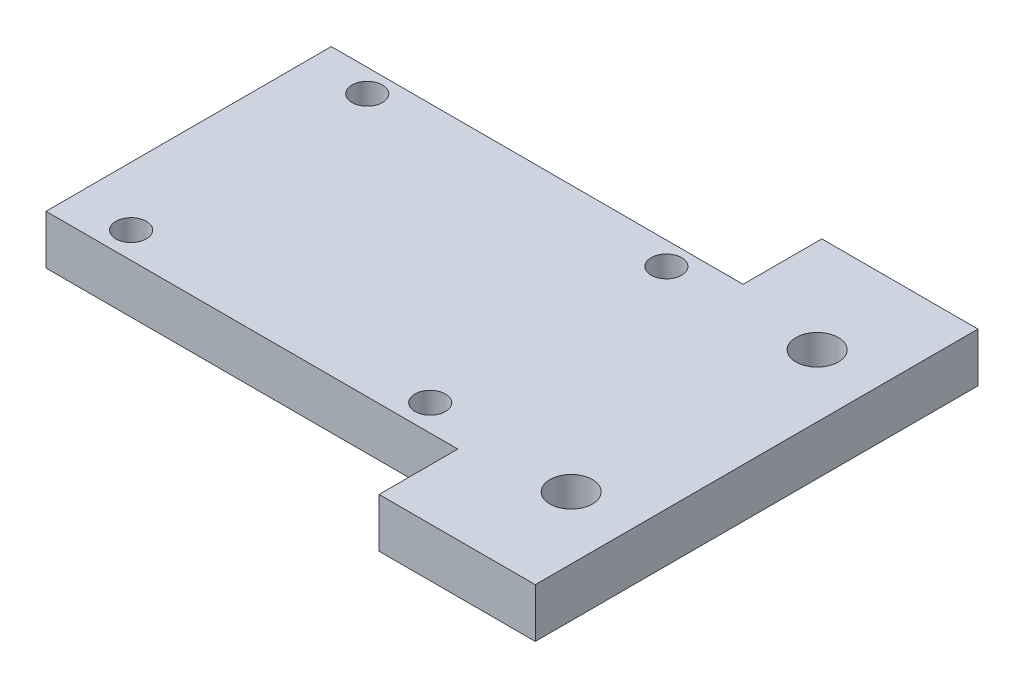
ISO-10303-21;
HEADER;
FILE_DESCRIPTION(('STEP AP214'),'2;1');
FILE_NAME('part.step','',(''),(''),'','','');
FILE_SCHEMA(('AUTOMOTIVE_DESIGN { 1 0 10303 214 1 1 1 1 }'));
ENDSEC;
DATA;
#1=APPLICATION_CONTEXT('core data for automotive mechanical design processes');
#2=APPLICATION_PROTOCOL_DEFINITION('international standard','automotive_design',2000,#1);
#3=PRODUCT_CONTEXT('',#1,'mechanical');
#4=PRODUCT('Part','Part','',(#3));
#5=PRODUCT_RELATED_PRODUCT_CATEGORY('part','',(#4));
#6=PRODUCT_DEFINITION_FORMATION('','',#4);
#7=PRODUCT_DEFINITION_CONTEXT('part definition',#1,'design');
#8=PRODUCT_DEFINITION('design','',#6,#7);
#9=PRODUCT_DEFINITION_SHAPE('','',#8);
#10=(LENGTH_UNIT() NAMED_UNIT(*) SI_UNIT(.MILLI.,.METRE.));
#11=(NAMED_UNIT(*) PLANE_ANGLE_UNIT() SI_UNIT($,.RADIAN.));
#12=(NAMED_UNIT(*) SI_UNIT($,.STERADIAN.) SOLID_ANGLE_UNIT());
#13=UNCERTAINTY_MEASURE_WITH_UNIT(LENGTH_MEASURE(1.E-05),#10,'distance_accuracy_value','');
#14=(GEOMETRIC_REPRESENTATION_CONTEXT(3) GLOBAL_UNCERTAINTY_ASSIGNED_CONTEXT((#13)) GLOBAL_UNIT_ASSIGNED_CONTEXT((#10,
#11,#12)) REPRESENTATION_CONTEXT('',''));
#15=CARTESIAN_POINT('',(0.,0.,0.));
#16=DIRECTION('',(0.,0.,1.));
#17=DIRECTION('',(1.,0.,0.));
#18=AXIS2_PLACEMENT_3D('',#15,#16,#17);
#19=CARTESIAN_POINT('',(0.,5.,0.));
#20=DIRECTION('',(0.,-1.,0.));
#21=DIRECTION('',(0.,0.,-1.));
#22=AXIS2_PLACEMENT_3D('',#19,#20,#21);
#23=PLANE('',#22);
#24=DIRECTION('',(0.,0.,-1.));
#25=VECTOR('',#24,1.);
#26=CARTESIAN_POINT('',(36.55,5.,-27.14922));
#27=LINE('',#26,#25);
#28=CARTESIAN_POINT('',(36.55,5.,39.1739551283588));
#29=VERTEX_POINT('',#28);
#30=CARTESIAN_POINT('',(36.55,5.,-5.82604487164121));
#31=VERTEX_POINT('',#30);
#32=EDGE_CURVE('E111',#29,#31,#27,.T.);
#33=ORIENTED_EDGE('',*,*,#32,.T.);
#34=DIRECTION('',(1.,0.,0.));
#35=VECTOR('',#34,1.);
#36=CARTESIAN_POINT('',(12.6932817043532,5.,-5.8260448716412));
#37=LINE('',#36,#35);
#38=CARTESIAN_POINT('',(20.675,5.,-5.8260448716412));
#39=VERTEX_POINT('',#38);
#40=EDGE_CURVE('E48',#39,#31,#37,.T.);
#41=ORIENTED_EDGE('',*,*,#40,.F.);
#42=DIRECTION('',(0.,0.,1.));
#43=VECTOR('',#42,1.);
#44=CARTESIAN_POINT('',(20.675,5.,2.1739551283588));
#45=LINE('',#44,#43);
#46=CARTESIAN_POINT('',(20.675,5.,2.1739551283588));
#47=VERTEX_POINT('',#46);
#48=EDGE_CURVE('E107',#39,#47,#45,.T.);
#49=ORIENTED_EDGE('',*,*,#48,.T.);
#50=DIRECTION('',(-1.,0.,0.));
#51=VECTOR('',#50,1.);
#52=CARTESIAN_POINT('',(-21.18269604,5.,2.1739551283588));
#53=LINE('',#52,#51);
#54=CARTESIAN_POINT('',(-21.18269604,5.,2.1739551283588));
#55=VERTEX_POINT('',#54);
#56=EDGE_CURVE('E116',#47,#55,#53,.T.);
#57=ORIENTED_EDGE('',*,*,#56,.T.);
#58=DIRECTION('',(0.,0.,1.));
#59=VECTOR('',#58,1.);
#60=CARTESIAN_POINT('',(-21.18269604,5.,31.1739551283588));
#61=LINE('',#60,#59);
#62=CARTESIAN_POINT('',(-21.18269604,5.,31.1739551283588));
#63=VERTEX_POINT('',#62);
#64=EDGE_CURVE('E119',#55,#63,#61,.T.);
#65=ORIENTED_EDGE('',*,*,#64,.T.);
#66=DIRECTION('',(1.,0.,0.));
#67=VECTOR('',#66,1.);
#68=CARTESIAN_POINT('',(20.675,5.,31.1739551283588));
#69=LINE('',#68,#67);
#70=CARTESIAN_POINT('',(20.675,5.,31.1739551283588));
#71=VERTEX_POINT('',#70);
#72=EDGE_CURVE('E129',#63,#71,#69,.T.);
#73=ORIENTED_EDGE('',*,*,#72,.T.);
#74=DIRECTION('',(0.,0.,1.));
#75=VECTOR('',#74,1.);
#76=CARTESIAN_POINT('',(20.675,5.,31.1739551283588));
#77=LINE('',#76,#75);
#78=CARTESIAN_POINT('',(20.675,5.,39.1739551283588));
#79=VERTEX_POINT('',#78);
#80=EDGE_CURVE('E131',#71,#79,#77,.T.);
#81=ORIENTED_EDGE('',*,*,#80,.T.);
#82=DIRECTION('',(-1.,0.,0.));
#83=VECTOR('',#82,1.);
#84=CARTESIAN_POINT('',(12.6932817043532,5.,39.1739551283588));
#85=LINE('',#84,#83);
#86=EDGE_CURVE('E102',#29,#79,#85,.T.);
#87=ORIENTED_EDGE('',*,*,#86,.F.);
#88=EDGE_LOOP('',(#33,#41,#49,#57,#65,#73,#81,#87));
#89=FACE_BOUND('',#88,.T.);
#90=CARTESIAN_POINT('',(30.2,5.,29.1739551283588));
#91=DIRECTION('',(0.,1.,0.));
#92=DIRECTION('',(0.,0.,-1.));
#93=AXIS2_PLACEMENT_3D('',#90,#91,#92);
#94=CIRCLE('',#93,2.159);
#95=CARTESIAN_POINT('',(30.2,5.,27.0149551283588));
#96=VERTEX_POINT('',#95);
#97=EDGE_CURVE('E139',#96,#96,#94,.T.);
#98=ORIENTED_EDGE('',*,*,#97,.F.);
#99=EDGE_LOOP('',(#98));
#100=FACE_BOUND('',#99,.T.);
#101=CARTESIAN_POINT('',(-15.2,5.,28.50156));
#102=DIRECTION('',(0.,1.,0.));
#103=DIRECTION('',(0.,0.,-1.));
#104=AXIS2_PLACEMENT_3D('',#101,#102,#103);
#105=CIRCLE('',#104,1.55);
#106=CARTESIAN_POINT('',(-15.2,5.,26.95156));
#107=VERTEX_POINT('',#106);
#108=EDGE_CURVE('E195',#107,#107,#105,.T.);
#109=ORIENTED_EDGE('',*,*,#108,.F.);
#110=EDGE_LOOP('',(#109));
#111=FACE_BOUND('',#110,.T.);
#112=CARTESIAN_POINT('',(15.19999,5.,28.50156));
#113=DIRECTION('',(0.,1.,0.));
#114=DIRECTION('',(0.,0.,1.));
#115=AXIS2_PLACEMENT_3D('',#112,#113,#114);
#116=CIRCLE('',#115,1.55);
#117=CARTESIAN_POINT('',(15.19999,5.,30.05156));
#118=VERTEX_POINT('',#117);
#119=EDGE_CURVE('E189',#118,#118,#116,.T.);
#120=ORIENTED_EDGE('',*,*,#119,.F.);
#121=EDGE_LOOP('',(#120));
#122=FACE_BOUND('',#121,.T.);
#123=CARTESIAN_POINT('',(-15.2,5.,4.50156000000001));
#124=DIRECTION('',(0.,1.,0.));
#125=DIRECTION('',(0.,0.,1.));
#126=AXIS2_PLACEMENT_3D('',#123,#124,#125);
#127=CIRCLE('',#126,1.55);
#128=CARTESIAN_POINT('',(-15.2,5.,6.05156000000001));
#129=VERTEX_POINT('',#128);
#130=EDGE_CURVE('E183',#129,#129,#127,.T.);
#131=ORIENTED_EDGE('',*,*,#130,.F.);
#132=EDGE_LOOP('',(#131));
#133=FACE_BOUND('',#132,.T.);
#134=CARTESIAN_POINT('',(15.2,5.,4.50156000000001));
#135=DIRECTION('',(0.,1.,0.));
#136=DIRECTION('',(0.,0.,-1.));
#137=AXIS2_PLACEMENT_3D('',#134,#135,#136);
#138=CIRCLE('',#137,1.55);
#139=CARTESIAN_POINT('',(15.2,5.,2.95156000000001));
#140=VERTEX_POINT('',#139);
#141=EDGE_CURVE('E177',#140,#140,#138,.T.);
#142=ORIENTED_EDGE('',*,*,#141,.F.);
#143=EDGE_LOOP('',(#142));
#144=FACE_BOUND('',#143,.T.);
#145=CARTESIAN_POINT('',(30.2,5.,4.1739551283588));
#146=DIRECTION('',(0.,1.,0.));
#147=DIRECTION('',(0.,0.,1.));
#148=AXIS2_PLACEMENT_3D('',#145,#146,#147);
#149=CIRCLE('',#148,2.159);
#150=CARTESIAN_POINT('',(30.2,5.,6.3329551283588));
#151=VERTEX_POINT('',#150);
#152=EDGE_CURVE('E171',#151,#151,#149,.T.);
#153=ORIENTED_EDGE('',*,*,#152,.F.);
#154=EDGE_LOOP('',(#153));
#155=FACE_BOUND('',#154,.T.);
#156=ADVANCED_FACE('F33',(#89,#100,#111,#122,#133,#144,#155),#23,.F.);
#157=CARTESIAN_POINT('',(0.,0.,0.));
#158=DIRECTION('',(0.,-1.,0.));
#159=DIRECTION('',(0.,0.,-1.));
#160=AXIS2_PLACEMENT_3D('',#157,#158,#159);
#161=PLANE('',#160);
#162=DIRECTION('',(1.,0.,0.));
#163=VECTOR('',#162,1.);
#164=CARTESIAN_POINT('',(12.6932817043532,0.,-5.8260448716412));
#165=LINE('',#164,#163);
#166=CARTESIAN_POINT('',(20.675,0.,-5.8260448716412));
#167=VERTEX_POINT('',#166);
#168=CARTESIAN_POINT('',(36.55,0.,-5.8260448716412));
#169=VERTEX_POINT('',#168);
#170=EDGE_CURVE('E98',#167,#169,#165,.T.);
#171=ORIENTED_EDGE('',*,*,#170,.T.);
#172=DIRECTION('',(0.,0.,-1.));
#173=VECTOR('',#172,1.);
#174=CARTESIAN_POINT('',(36.55,0.,-27.14922));
#175=LINE('',#174,#173);
#176=CARTESIAN_POINT('',(36.55,0.,39.1739551283588));
#177=VERTEX_POINT('',#176);
#178=EDGE_CURVE('E117',#177,#169,#175,.T.);
#179=ORIENTED_EDGE('',*,*,#178,.F.);
#180=DIRECTION('',(-1.,0.,0.));
#181=VECTOR('',#180,1.);
#182=CARTESIAN_POINT('',(12.6932817043532,0.,39.1739551283588));
#183=LINE('',#182,#181);
#184=CARTESIAN_POINT('',(20.675,0.,39.1739551283588));
#185=VERTEX_POINT('',#184);
#186=EDGE_CURVE('E55',#177,#185,#183,.T.);
#187=ORIENTED_EDGE('',*,*,#186,.T.);
#188=DIRECTION('',(0.,0.,1.));
#189=VECTOR('',#188,1.);
#190=CARTESIAN_POINT('',(20.675,0.,31.1739551283588));
#191=LINE('',#190,#189);
#192=CARTESIAN_POINT('',(20.675,0.,31.1739551283588));
#193=VERTEX_POINT('',#192);
#194=EDGE_CURVE('E122',#193,#185,#191,.T.);
#195=ORIENTED_EDGE('',*,*,#194,.F.);
#196=DIRECTION('',(1.,0.,0.));
#197=VECTOR('',#196,1.);
#198=CARTESIAN_POINT('',(20.675,0.,31.1739551283588));
#199=LINE('',#198,#197);
#200=CARTESIAN_POINT('',(-21.18269604,0.,31.1739551283588));
#201=VERTEX_POINT('',#200);
#202=EDGE_CURVE('E143',#201,#193,#199,.T.);
#203=ORIENTED_EDGE('',*,*,#202,.F.);
#204=DIRECTION('',(0.,0.,1.));
#205=VECTOR('',#204,1.);
#206=CARTESIAN_POINT('',(-21.18269604,0.,31.1739551283588));
#207=LINE('',#206,#205);
#208=CARTESIAN_POINT('',(-21.18269604,0.,2.1739551283588));
#209=VERTEX_POINT('',#208);
#210=EDGE_CURVE('E141',#209,#201,#207,.T.);
#211=ORIENTED_EDGE('',*,*,#210,.F.);
#212=DIRECTION('',(-1.,0.,0.));
#213=VECTOR('',#212,1.);
#214=CARTESIAN_POINT('',(-21.18269604,0.,2.1739551283588));
#215=LINE('',#214,#213);
#216=CARTESIAN_POINT('',(20.675,0.,2.1739551283588));
#217=VERTEX_POINT('',#216);
#218=EDGE_CURVE('E138',#217,#209,#215,.T.);
#219=ORIENTED_EDGE('',*,*,#218,.F.);
#220=DIRECTION('',(0.,0.,1.));
#221=VECTOR('',#220,1.);
#222=CARTESIAN_POINT('',(20.675,0.,2.1739551283588));
#223=LINE('',#222,#221);
#224=EDGE_CURVE('E136',#167,#217,#223,.T.);
#225=ORIENTED_EDGE('',*,*,#224,.F.);
#226=EDGE_LOOP('',(#171,#179,#187,#195,#203,#211,#219,#225));
#227=FACE_BOUND('',#226,.T.);
#228=CARTESIAN_POINT('',(15.2,0.,4.50156000000001));
#229=DIRECTION('',(0.,1.,0.));
#230=DIRECTION('',(0.,0.,-1.));
#231=AXIS2_PLACEMENT_3D('',#228,#229,#230);
#232=CIRCLE('',#231,1.55);
#233=CARTESIAN_POINT('',(15.2,0.,2.95156000000001));
#234=VERTEX_POINT('',#233);
#235=EDGE_CURVE('E174',#234,#234,#232,.T.);
#236=ORIENTED_EDGE('',*,*,#235,.T.);
#237=EDGE_LOOP('',(#236));
#238=FACE_BOUND('',#237,.T.);
#239=CARTESIAN_POINT('',(15.19999,0.,28.50156));
#240=DIRECTION('',(0.,1.,0.));
#241=DIRECTION('',(0.,0.,1.));
#242=AXIS2_PLACEMENT_3D('',#239,#240,#241);
#243=CIRCLE('',#242,1.55);
#244=CARTESIAN_POINT('',(15.19999,0.,30.05156));
#245=VERTEX_POINT('',#244);
#246=EDGE_CURVE('E186',#245,#245,#243,.T.);
#247=ORIENTED_EDGE('',*,*,#246,.T.);
#248=EDGE_LOOP('',(#247));
#249=FACE_BOUND('',#248,.T.);
#250=CARTESIAN_POINT('',(30.2,0.,29.1739551283588));
#251=DIRECTION('',(0.,1.,0.));
#252=DIRECTION('',(0.,0.,-1.));
#253=AXIS2_PLACEMENT_3D('',#250,#251,#252);
#254=CIRCLE('',#253,2.159);
#255=CARTESIAN_POINT('',(30.2,0.,27.0149551283588));
#256=VERTEX_POINT('',#255);
#257=EDGE_CURVE('E125',#256,#256,#254,.T.);
#258=ORIENTED_EDGE('',*,*,#257,.T.);
#259=EDGE_LOOP('',(#258));
#260=FACE_BOUND('',#259,.T.);
#261=CARTESIAN_POINT('',(-15.2,0.,28.50156));
#262=DIRECTION('',(0.,1.,0.));
#263=DIRECTION('',(0.,0.,-1.));
#264=AXIS2_PLACEMENT_3D('',#261,#262,#263);
#265=CIRCLE('',#264,1.55);
#266=CARTESIAN_POINT('',(-15.2,0.,26.95156));
#267=VERTEX_POINT('',#266);
#268=EDGE_CURVE('E192',#267,#267,#265,.T.);
#269=ORIENTED_EDGE('',*,*,#268,.T.);
#270=EDGE_LOOP('',(#269));
#271=FACE_BOUND('',#270,.T.);
#272=CARTESIAN_POINT('',(-15.2,0.,4.50156000000001));
#273=DIRECTION('',(0.,1.,0.));
#274=DIRECTION('',(0.,0.,1.));
#275=AXIS2_PLACEMENT_3D('',#272,#273,#274);
#276=CIRCLE('',#275,1.55);
#277=CARTESIAN_POINT('',(-15.2,0.,6.05156000000001));
#278=VERTEX_POINT('',#277);
#279=EDGE_CURVE('E180',#278,#278,#276,.T.);
#280=ORIENTED_EDGE('',*,*,#279,.T.);
#281=EDGE_LOOP('',(#280));
#282=FACE_BOUND('',#281,.T.);
#283=CARTESIAN_POINT('',(30.2,0.,4.1739551283588));
#284=DIRECTION('',(0.,1.,0.));
#285=DIRECTION('',(0.,0.,1.));
#286=AXIS2_PLACEMENT_3D('',#283,#284,#285);
#287=CIRCLE('',#286,2.159);
#288=CARTESIAN_POINT('',(30.2,0.,6.3329551283588));
#289=VERTEX_POINT('',#288);
#290=EDGE_CURVE('E170',#289,#289,#287,.T.);
#291=ORIENTED_EDGE('',*,*,#290,.T.);
#292=EDGE_LOOP('',(#291));
#293=FACE_BOUND('',#292,.T.);
#294=ADVANCED_FACE('F159',(#227,#238,#249,#260,#271,#282,#293),#161,.T.);
#295=CARTESIAN_POINT('',(20.675,5.,2.1739551283588));
#296=DIRECTION('',(1.,0.,0.));
#297=DIRECTION('',(0.,0.,-1.));
#298=AXIS2_PLACEMENT_3D('',#295,#296,#297);
#299=PLANE('',#298);
#300=ORIENTED_EDGE('',*,*,#48,.F.);
#301=DIRECTION('',(0.,-1.,0.));
#302=VECTOR('',#301,1.);
#303=CARTESIAN_POINT('',(20.675,5.,-5.8260448716412));
#304=LINE('',#303,#302);
#305=EDGE_CURVE('E95',#39,#167,#304,.T.);
#306=ORIENTED_EDGE('',*,*,#305,.T.);
#307=ORIENTED_EDGE('',*,*,#224,.T.);
#308=DIRECTION('',(0.,-1.,0.));
#309=VECTOR('',#308,1.);
#310=CARTESIAN_POINT('',(20.675,5.,2.1739551283588));
#311=LINE('',#310,#309);
#312=EDGE_CURVE('E114',#47,#217,#311,.T.);
#313=ORIENTED_EDGE('',*,*,#312,.F.);
#314=EDGE_LOOP('',(#300,#306,#307,#313));
#315=FACE_BOUND('',#314,.T.);
#316=ADVANCED_FACE('F35',(#315),#299,.F.);
#317=CARTESIAN_POINT('',(-21.18269604,5.,2.1739551283588));
#318=DIRECTION('',(0.,0.,1.));
#319=DIRECTION('',(1.,0.,0.));
#320=AXIS2_PLACEMENT_3D('',#317,#318,#319);
#321=PLANE('',#320);
#322=ORIENTED_EDGE('',*,*,#218,.T.);
#323=DIRECTION('',(0.,-1.,0.));
#324=VECTOR('',#323,1.);
#325=CARTESIAN_POINT('',(-21.18269604,5.,2.1739551283588));
#326=LINE('',#325,#324);
#327=EDGE_CURVE('E152',#55,#209,#326,.T.);
#328=ORIENTED_EDGE('',*,*,#327,.F.);
#329=ORIENTED_EDGE('',*,*,#56,.F.);
#330=ORIENTED_EDGE('',*,*,#312,.T.);
#331=EDGE_LOOP('',(#322,#328,#329,#330));
#332=FACE_BOUND('',#331,.T.);
#333=ADVANCED_FACE('F236',(#332),#321,.F.);
#334=CARTESIAN_POINT('',(-21.18269604,5.,31.1739551283588));
#335=DIRECTION('',(1.,0.,0.));
#336=DIRECTION('',(0.,0.,-1.));
#337=AXIS2_PLACEMENT_3D('',#334,#335,#336);
#338=PLANE('',#337);
#339=ORIENTED_EDGE('',*,*,#210,.T.);
#340=DIRECTION('',(0.,-1.,0.));
#341=VECTOR('',#340,1.);
#342=CARTESIAN_POINT('',(-21.18269604,5.,31.1739551283588));
#343=LINE('',#342,#341);
#344=EDGE_CURVE('E149',#63,#201,#343,.T.);
#345=ORIENTED_EDGE('',*,*,#344,.F.);
#346=ORIENTED_EDGE('',*,*,#64,.F.);
#347=ORIENTED_EDGE('',*,*,#327,.T.);
#348=EDGE_LOOP('',(#339,#345,#346,#347));
#349=FACE_BOUND('',#348,.T.);
#350=ADVANCED_FACE('F233',(#349),#338,.F.);
#351=CARTESIAN_POINT('',(20.675,5.,31.1739551283588));
#352=DIRECTION('',(0.,0.,-1.));
#353=DIRECTION('',(-1.,0.,0.));
#354=AXIS2_PLACEMENT_3D('',#351,#352,#353);
#355=PLANE('',#354);
#356=ORIENTED_EDGE('',*,*,#202,.T.);
#357=DIRECTION('',(0.,-1.,0.));
#358=VECTOR('',#357,1.);
#359=CARTESIAN_POINT('',(20.675,5.,31.1739551283588));
#360=LINE('',#359,#358);
#361=EDGE_CURVE('E135',#71,#193,#360,.T.);
#362=ORIENTED_EDGE('',*,*,#361,.F.);
#363=ORIENTED_EDGE('',*,*,#72,.F.);
#364=ORIENTED_EDGE('',*,*,#344,.T.);
#365=EDGE_LOOP('',(#356,#362,#363,#364));
#366=FACE_BOUND('',#365,.T.);
#367=ADVANCED_FACE('F229',(#366),#355,.F.);
#368=CARTESIAN_POINT('',(20.675,5.,31.1739551283588));
#369=DIRECTION('',(1.,0.,0.));
#370=DIRECTION('',(0.,0.,-1.));
#371=AXIS2_PLACEMENT_3D('',#368,#369,#370);
#372=PLANE('',#371);
#373=ORIENTED_EDGE('',*,*,#194,.T.);
#374=DIRECTION('',(0.,1.,0.));
#375=VECTOR('',#374,1.);
#376=CARTESIAN_POINT('',(20.675,5.,39.1739551283588));
#377=LINE('',#376,#375);
#378=EDGE_CURVE('E166',#185,#79,#377,.T.);
#379=ORIENTED_EDGE('',*,*,#378,.T.);
#380=ORIENTED_EDGE('',*,*,#80,.F.);
#381=ORIENTED_EDGE('',*,*,#361,.T.);
#382=EDGE_LOOP('',(#373,#379,#380,#381));
#383=FACE_BOUND('',#382,.T.);
#384=ADVANCED_FACE('F218',(#383),#372,.F.);
#385=CARTESIAN_POINT('',(36.55,5.,-27.14922));
#386=DIRECTION('',(-1.,0.,0.));
#387=DIRECTION('',(0.,0.,1.));
#388=AXIS2_PLACEMENT_3D('',#385,#386,#387);
#389=PLANE('',#388);
#390=ORIENTED_EDGE('',*,*,#178,.T.);
#391=DIRECTION('',(0.,1.,0.));
#392=VECTOR('',#391,1.);
#393=CARTESIAN_POINT('',(36.55,5.,-5.82604487164121));
#394=LINE('',#393,#392);
#395=EDGE_CURVE('E11',#169,#31,#394,.T.);
#396=ORIENTED_EDGE('',*,*,#395,.T.);
#397=ORIENTED_EDGE('',*,*,#32,.F.);
#398=DIRECTION('',(0.,-1.,0.));
#399=VECTOR('',#398,1.);
#400=CARTESIAN_POINT('',(36.55,5.,39.1739551283588));
#401=LINE('',#400,#399);
#402=EDGE_CURVE('E41',#29,#177,#401,.T.);
#403=ORIENTED_EDGE('',*,*,#402,.T.);
#404=EDGE_LOOP('',(#390,#396,#397,#403));
#405=FACE_BOUND('',#404,.T.);
#406=ADVANCED_FACE('F157',(#405),#389,.F.);
#407=CARTESIAN_POINT('',(30.2,5.,29.1739551283588));
#408=DIRECTION('',(0.,-1.,0.));
#409=DIRECTION('',(0.,0.,-1.));
#410=AXIS2_PLACEMENT_3D('',#407,#408,#409);
#411=CYLINDRICAL_SURFACE('',#410,2.159);
#412=ORIENTED_EDGE('',*,*,#97,.T.);
#413=EDGE_LOOP('',(#412));
#414=FACE_BOUND('',#413,.T.);
#415=ORIENTED_EDGE('',*,*,#257,.F.);
#416=EDGE_LOOP('',(#415));
#417=FACE_BOUND('',#416,.T.);
#418=ADVANCED_FACE('F207',(#414,#417),#411,.F.);
#419=CARTESIAN_POINT('',(-15.2,5.,28.50156));
#420=DIRECTION('',(0.,-1.,0.));
#421=DIRECTION('',(0.,0.,-1.));
#422=AXIS2_PLACEMENT_3D('',#419,#420,#421);
#423=CYLINDRICAL_SURFACE('',#422,1.55);
#424=ORIENTED_EDGE('',*,*,#108,.T.);
#425=EDGE_LOOP('',(#424));
#426=FACE_BOUND('',#425,.T.);
#427=ORIENTED_EDGE('',*,*,#268,.F.);
#428=EDGE_LOOP('',(#427));
#429=FACE_BOUND('',#428,.T.);
#430=ADVANCED_FACE('F209',(#426,#429),#423,.F.);
#431=CARTESIAN_POINT('',(15.19999,5.,28.50156));
#432=DIRECTION('',(0.,-1.,0.));
#433=DIRECTION('',(0.,0.,-1.));
#434=AXIS2_PLACEMENT_3D('',#431,#432,#433);
#435=CYLINDRICAL_SURFACE('',#434,1.55);
#436=ORIENTED_EDGE('',*,*,#119,.T.);
#437=EDGE_LOOP('',(#436));
#438=FACE_BOUND('',#437,.T.);
#439=ORIENTED_EDGE('',*,*,#246,.F.);
#440=EDGE_LOOP('',(#439));
#441=FACE_BOUND('',#440,.T.);
#442=ADVANCED_FACE('F215',(#438,#441),#435,.F.);
#443=CARTESIAN_POINT('',(-15.2,5.,4.50156000000001));
#444=DIRECTION('',(0.,-1.,0.));
#445=DIRECTION('',(0.,0.,-1.));
#446=AXIS2_PLACEMENT_3D('',#443,#444,#445);
#447=CYLINDRICAL_SURFACE('',#446,1.55);
#448=ORIENTED_EDGE('',*,*,#130,.T.);
#449=EDGE_LOOP('',(#448));
#450=FACE_BOUND('',#449,.T.);
#451=ORIENTED_EDGE('',*,*,#279,.F.);
#452=EDGE_LOOP('',(#451));
#453=FACE_BOUND('',#452,.T.);
#454=ADVANCED_FACE('F266',(#450,#453),#447,.F.);
#455=CARTESIAN_POINT('',(15.2,5.,4.50156000000001));
#456=DIRECTION('',(0.,-1.,0.));
#457=DIRECTION('',(0.,0.,-1.));
#458=AXIS2_PLACEMENT_3D('',#455,#456,#457);
#459=CYLINDRICAL_SURFACE('',#458,1.55);
#460=ORIENTED_EDGE('',*,*,#141,.T.);
#461=EDGE_LOOP('',(#460));
#462=FACE_BOUND('',#461,.T.);
#463=ORIENTED_EDGE('',*,*,#235,.F.);
#464=EDGE_LOOP('',(#463));
#465=FACE_BOUND('',#464,.T.);
#466=ADVANCED_FACE('F260',(#462,#465),#459,.F.);
#467=CARTESIAN_POINT('',(30.2,5.,4.1739551283588));
#468=DIRECTION('',(0.,-1.,0.));
#469=DIRECTION('',(0.,0.,-1.));
#470=AXIS2_PLACEMENT_3D('',#467,#468,#469);
#471=CYLINDRICAL_SURFACE('',#470,2.159);
#472=ORIENTED_EDGE('',*,*,#152,.T.);
#473=EDGE_LOOP('',(#472));
#474=FACE_BOUND('',#473,.T.);
#475=ORIENTED_EDGE('',*,*,#290,.F.);
#476=EDGE_LOOP('',(#475));
#477=FACE_BOUND('',#476,.T.);
#478=ADVANCED_FACE('F253',(#474,#477),#471,.F.);
#479=CARTESIAN_POINT('',(12.6932817043532,0.,39.1739551283588));
#480=DIRECTION('',(0.,0.,-1.));
#481=DIRECTION('',(-1.,0.,0.));
#482=AXIS2_PLACEMENT_3D('',#479,#480,#481);
#483=PLANE('',#482);
#484=ORIENTED_EDGE('',*,*,#186,.F.);
#485=ORIENTED_EDGE('',*,*,#402,.F.);
#486=ORIENTED_EDGE('',*,*,#86,.T.);
#487=ORIENTED_EDGE('',*,*,#378,.F.);
#488=EDGE_LOOP('',(#484,#485,#486,#487));
#489=FACE_BOUND('',#488,.T.);
#490=ADVANCED_FACE('F251',(#489),#483,.F.);
#491=CARTESIAN_POINT('',(12.6932817043532,0.,-5.8260448716412));
#492=DIRECTION('',(0.,0.,1.));
#493=DIRECTION('',(1.,0.,0.));
#494=AXIS2_PLACEMENT_3D('',#491,#492,#493);
#495=PLANE('',#494);
#496=ORIENTED_EDGE('',*,*,#40,.T.);
#497=ORIENTED_EDGE('',*,*,#395,.F.);
#498=ORIENTED_EDGE('',*,*,#170,.F.);
#499=ORIENTED_EDGE('',*,*,#305,.F.);
#500=EDGE_LOOP('',(#496,#497,#498,#499));
#501=FACE_BOUND('',#500,.T.);
#502=ADVANCED_FACE('F96',(#501),#495,.F.);
#503=CLOSED_SHELL('',(#156,#294,#316,#333,#350,#367,#384,#406,#418,#430,#442,#454,#466,#478,
#490,#502));
#504=MANIFOLD_SOLID_BREP('B2',#503);
#505=ADVANCED_BREP_SHAPE_REPRESENTATION('',(#18,#504),#14);
#506=SHAPE_DEFINITION_REPRESENTATION(#9,#505);
ENDSEC;
END-ISO-10303-21;
